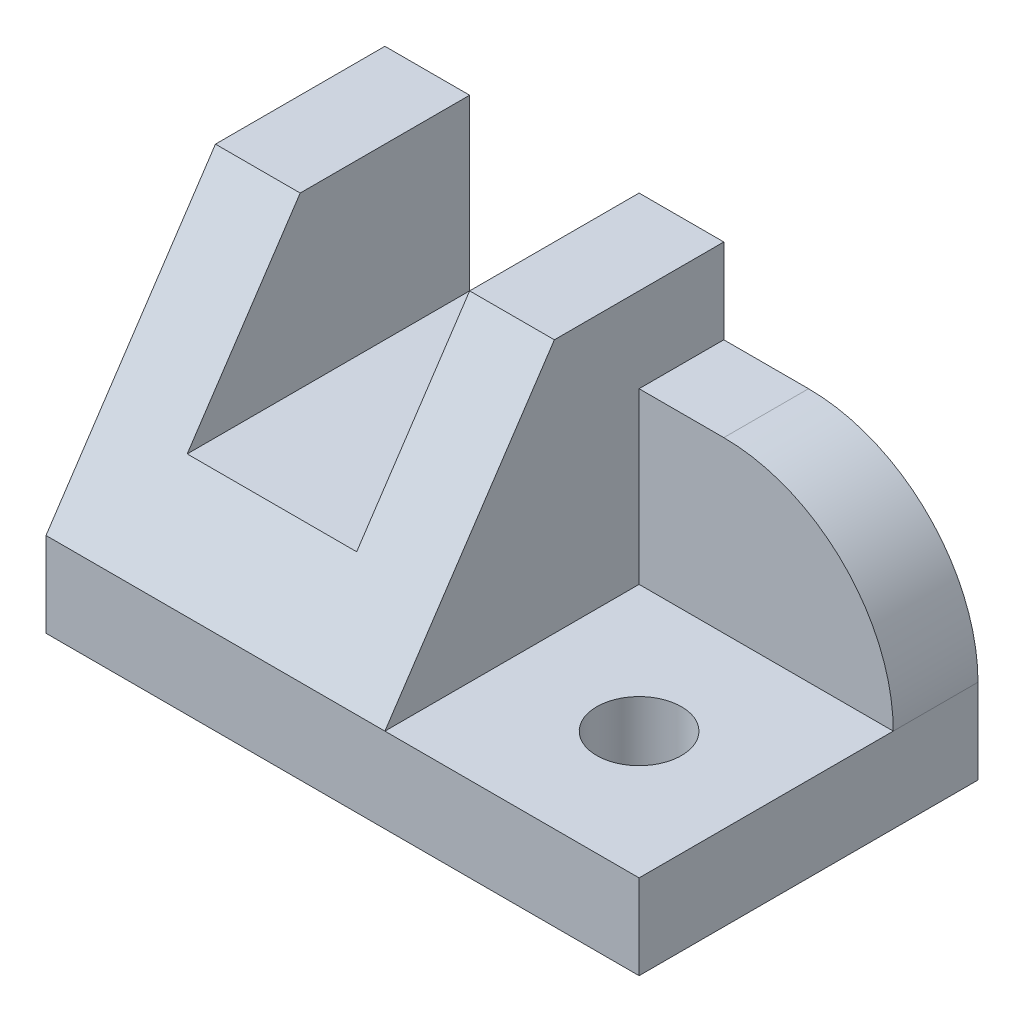
ISO-10303-21;
HEADER;
FILE_DESCRIPTION(('STEP AP214'),'2;1');
FILE_NAME('part.step','',(''),(''),'','','');
FILE_SCHEMA(('AUTOMOTIVE_DESIGN { 1 0 10303 214 1 1 1 1 }'));
ENDSEC;
DATA;
#1=APPLICATION_CONTEXT('core data for automotive mechanical design processes');
#2=APPLICATION_PROTOCOL_DEFINITION('international standard','automotive_design',2000,#1);
#3=PRODUCT_CONTEXT('',#1,'mechanical');
#4=PRODUCT('Part','Part','',(#3));
#5=PRODUCT_RELATED_PRODUCT_CATEGORY('part','',(#4));
#6=PRODUCT_DEFINITION_FORMATION('','',#4);
#7=PRODUCT_DEFINITION_CONTEXT('part definition',#1,'design');
#8=PRODUCT_DEFINITION('design','',#6,#7);
#9=PRODUCT_DEFINITION_SHAPE('','',#8);
#10=(LENGTH_UNIT() NAMED_UNIT(*) SI_UNIT(.MILLI.,.METRE.));
#11=(NAMED_UNIT(*) PLANE_ANGLE_UNIT() SI_UNIT($,.RADIAN.));
#12=(NAMED_UNIT(*) SI_UNIT($,.STERADIAN.) SOLID_ANGLE_UNIT());
#13=UNCERTAINTY_MEASURE_WITH_UNIT(LENGTH_MEASURE(1.E-05),#10,'distance_accuracy_value','');
#14=(GEOMETRIC_REPRESENTATION_CONTEXT(3) GLOBAL_UNCERTAINTY_ASSIGNED_CONTEXT((#13)) GLOBAL_UNIT_ASSIGNED_CONTEXT((#10,
#11,#12)) REPRESENTATION_CONTEXT('',''));
#15=CARTESIAN_POINT('',(0.,0.,0.));
#16=DIRECTION('',(0.,0.,1.));
#17=DIRECTION('',(1.,0.,0.));
#18=AXIS2_PLACEMENT_3D('',#15,#16,#17);
#19=CARTESIAN_POINT('',(50.,-30.,10.));
#20=DIRECTION('',(0.,0.,-1.));
#21=DIRECTION('',(-1.,0.,0.));
#22=AXIS2_PLACEMENT_3D('',#19,#20,#21);
#23=CYLINDRICAL_SURFACE('',#22,20.);
#24=CARTESIAN_POINT('',(50.,-30.,0.));
#25=DIRECTION('',(0.,0.,1.));
#26=DIRECTION('',(1.,0.,0.));
#27=AXIS2_PLACEMENT_3D('',#24,#25,#26);
#28=CIRCLE('',#27,20.);
#29=CARTESIAN_POINT('',(50.,-10.,0.));
#30=VERTEX_POINT('',#29);
#31=CARTESIAN_POINT('',(70.,-30.,0.));
#32=VERTEX_POINT('',#31);
#33=EDGE_CURVE('E158',#30,#32,#28,.F.);
#34=ORIENTED_EDGE('',*,*,#33,.F.);
#35=DIRECTION('',(0.,0.,-1.));
#36=VECTOR('',#35,1.);
#37=CARTESIAN_POINT('',(50.,-10.,10.));
#38=LINE('',#37,#36);
#39=CARTESIAN_POINT('',(50.,-10.,10.));
#40=VERTEX_POINT('',#39);
#41=EDGE_CURVE('E182',#40,#30,#38,.T.);
#42=ORIENTED_EDGE('',*,*,#41,.F.);
#43=CARTESIAN_POINT('',(50.,-30.,10.));
#44=DIRECTION('',(0.,0.,1.));
#45=DIRECTION('',(1.,0.,0.));
#46=AXIS2_PLACEMENT_3D('',#43,#44,#45);
#47=CIRCLE('',#46,20.);
#48=CARTESIAN_POINT('',(70.,-30.,10.));
#49=VERTEX_POINT('',#48);
#50=EDGE_CURVE('E167',#40,#49,#47,.F.);
#51=ORIENTED_EDGE('',*,*,#50,.T.);
#52=DIRECTION('',(0.,0.,-1.));
#53=VECTOR('',#52,1.);
#54=CARTESIAN_POINT('',(70.,-30.,10.));
#55=LINE('',#54,#53);
#56=EDGE_CURVE('E157',#49,#32,#55,.T.);
#57=ORIENTED_EDGE('',*,*,#56,.T.);
#58=EDGE_LOOP('',(#34,#42,#51,#57));
#59=FACE_BOUND('',#58,.T.);
#60=ADVANCED_FACE('F37',(#59),#23,.T.);
#61=CARTESIAN_POINT('',(0.,-10.,10.));
#62=DIRECTION('',(0.,1.,0.));
#63=DIRECTION('',(-1.,0.,0.));
#64=AXIS2_PLACEMENT_3D('',#61,#62,#63);
#65=PLANE('',#64);
#66=DIRECTION('',(1.,0.,0.));
#67=VECTOR('',#66,1.);
#68=CARTESIAN_POINT('',(0.,-10.,0.));
#69=LINE('',#68,#67);
#70=CARTESIAN_POINT('',(40.,-10.,0.));
#71=VERTEX_POINT('',#70);
#72=EDGE_CURVE('E161',#71,#30,#69,.T.);
#73=ORIENTED_EDGE('',*,*,#72,.F.);
#74=DIRECTION('',(0.,0.,-1.));
#75=VECTOR('',#74,1.);
#76=CARTESIAN_POINT('',(40.,-10.,10.));
#77=LINE('',#76,#75);
#78=CARTESIAN_POINT('',(40.,-10.,10.));
#79=VERTEX_POINT('',#78);
#80=EDGE_CURVE('E179',#79,#71,#77,.T.);
#81=ORIENTED_EDGE('',*,*,#80,.F.);
#82=DIRECTION('',(1.,0.,0.));
#83=VECTOR('',#82,1.);
#84=CARTESIAN_POINT('',(0.,-10.,10.));
#85=LINE('',#84,#83);
#86=EDGE_CURVE('E169',#79,#40,#85,.T.);
#87=ORIENTED_EDGE('',*,*,#86,.T.);
#88=ORIENTED_EDGE('',*,*,#41,.T.);
#89=EDGE_LOOP('',(#73,#81,#87,#88));
#90=FACE_BOUND('',#89,.T.);
#91=ADVANCED_FACE('F280',(#90),#65,.T.);
#92=CARTESIAN_POINT('',(0.,0.,10.));
#93=DIRECTION('',(0.,0.,1.));
#94=DIRECTION('',(1.,0.,0.));
#95=AXIS2_PLACEMENT_3D('',#92,#93,#94);
#96=PLANE('',#95);
#97=ORIENTED_EDGE('',*,*,#50,.F.);
#98=ORIENTED_EDGE('',*,*,#86,.F.);
#99=DIRECTION('',(0.,-1.,0.));
#100=VECTOR('',#99,1.);
#101=CARTESIAN_POINT('',(40.,0.,10.));
#102=LINE('',#101,#100);
#103=CARTESIAN_POINT('',(40.,-30.,10.));
#104=VERTEX_POINT('',#103);
#105=EDGE_CURVE('E172',#79,#104,#102,.T.);
#106=ORIENTED_EDGE('',*,*,#105,.T.);
#107=DIRECTION('',(-1.,0.,0.));
#108=VECTOR('',#107,1.);
#109=CARTESIAN_POINT('',(0.,-30.,10.));
#110=LINE('',#109,#108);
#111=EDGE_CURVE('E174',#49,#104,#110,.T.);
#112=ORIENTED_EDGE('',*,*,#111,.F.);
#113=EDGE_LOOP('',(#97,#98,#106,#112));
#114=FACE_BOUND('',#113,.T.);
#115=ADVANCED_FACE('F278',(#114),#96,.T.);
#116=CARTESIAN_POINT('',(0.,0.,0.));
#117=DIRECTION('',(0.,0.,1.));
#118=DIRECTION('',(1.,0.,0.));
#119=AXIS2_PLACEMENT_3D('',#116,#117,#118);
#120=PLANE('',#119);
#121=ORIENTED_EDGE('',*,*,#33,.T.);
#122=DIRECTION('',(0.,1.,0.));
#123=VECTOR('',#122,1.);
#124=CARTESIAN_POINT('',(70.,0.,0.));
#125=LINE('',#124,#123);
#126=CARTESIAN_POINT('',(70.,-40.,0.));
#127=VERTEX_POINT('',#126);
#128=EDGE_CURVE('E215',#127,#32,#125,.T.);
#129=ORIENTED_EDGE('',*,*,#128,.F.);
#130=DIRECTION('',(1.,0.,0.));
#131=VECTOR('',#130,1.);
#132=CARTESIAN_POINT('',(0.,-40.,0.));
#133=LINE('',#132,#131);
#134=CARTESIAN_POINT('',(0.,-40.,0.));
#135=VERTEX_POINT('',#134);
#136=EDGE_CURVE('E152',#135,#127,#133,.T.);
#137=ORIENTED_EDGE('',*,*,#136,.F.);
#138=DIRECTION('',(0.,-1.,0.));
#139=VECTOR('',#138,1.);
#140=CARTESIAN_POINT('',(0.,0.,0.));
#141=LINE('',#140,#139);
#142=CARTESIAN_POINT('',(0.,0.,0.));
#143=VERTEX_POINT('',#142);
#144=EDGE_CURVE('E236',#143,#135,#141,.T.);
#145=ORIENTED_EDGE('',*,*,#144,.F.);
#146=DIRECTION('',(1.,0.,0.));
#147=VECTOR('',#146,1.);
#148=CARTESIAN_POINT('',(0.,0.,0.));
#149=LINE('',#148,#147);
#150=CARTESIAN_POINT('',(10.,0.,0.));
#151=VERTEX_POINT('',#150);
#152=EDGE_CURVE('E233',#143,#151,#149,.T.);
#153=ORIENTED_EDGE('',*,*,#152,.T.);
#154=DIRECTION('',(0.,-1.,0.));
#155=VECTOR('',#154,1.);
#156=CARTESIAN_POINT('',(10.,0.,0.));
#157=LINE('',#156,#155);
#158=CARTESIAN_POINT('',(10.,-20.,0.));
#159=VERTEX_POINT('',#158);
#160=EDGE_CURVE('E230',#151,#159,#157,.T.);
#161=ORIENTED_EDGE('',*,*,#160,.T.);
#162=DIRECTION('',(1.,0.,0.));
#163=VECTOR('',#162,1.);
#164=CARTESIAN_POINT('',(0.,-20.,0.));
#165=LINE('',#164,#163);
#166=CARTESIAN_POINT('',(30.,-20.,0.));
#167=VERTEX_POINT('',#166);
#168=EDGE_CURVE('E227',#159,#167,#165,.T.);
#169=ORIENTED_EDGE('',*,*,#168,.T.);
#170=DIRECTION('',(0.,1.,0.));
#171=VECTOR('',#170,1.);
#172=CARTESIAN_POINT('',(30.,0.,0.));
#173=LINE('',#172,#171);
#174=CARTESIAN_POINT('',(30.,0.,0.));
#175=VERTEX_POINT('',#174);
#176=EDGE_CURVE('E224',#167,#175,#173,.T.);
#177=ORIENTED_EDGE('',*,*,#176,.T.);
#178=DIRECTION('',(1.,0.,0.));
#179=VECTOR('',#178,1.);
#180=CARTESIAN_POINT('',(0.,0.,0.));
#181=LINE('',#180,#179);
#182=CARTESIAN_POINT('',(40.,0.,0.));
#183=VERTEX_POINT('',#182);
#184=EDGE_CURVE('E221',#175,#183,#181,.T.);
#185=ORIENTED_EDGE('',*,*,#184,.T.);
#186=DIRECTION('',(0.,-1.,0.));
#187=VECTOR('',#186,1.);
#188=CARTESIAN_POINT('',(40.,0.,0.));
#189=LINE('',#188,#187);
#190=EDGE_CURVE('E217',#183,#71,#189,.T.);
#191=ORIENTED_EDGE('',*,*,#190,.T.);
#192=ORIENTED_EDGE('',*,*,#72,.T.);
#193=EDGE_LOOP('',(#121,#129,#137,#145,#153,#161,#169,#177,#185,#191,#192));
#194=FACE_BOUND('',#193,.T.);
#195=ADVANCED_FACE('F253',(#194),#120,.F.);
#196=CARTESIAN_POINT('',(70.,0.,40.));
#197=DIRECTION('',(-1.,0.,0.));
#198=DIRECTION('',(0.,0.,1.));
#199=AXIS2_PLACEMENT_3D('',#196,#197,#198);
#200=PLANE('',#199);
#201=ORIENTED_EDGE('',*,*,#128,.T.);
#202=ORIENTED_EDGE('',*,*,#56,.F.);
#203=DIRECTION('',(0.,0.,-1.));
#204=VECTOR('',#203,1.);
#205=CARTESIAN_POINT('',(70.,-30.,40.));
#206=LINE('',#205,#204);
#207=CARTESIAN_POINT('',(70.,-30.,40.));
#208=VERTEX_POINT('',#207);
#209=EDGE_CURVE('E137',#208,#49,#206,.T.);
#210=ORIENTED_EDGE('',*,*,#209,.F.);
#211=DIRECTION('',(0.,1.,0.));
#212=VECTOR('',#211,1.);
#213=CARTESIAN_POINT('',(70.,0.,40.));
#214=LINE('',#213,#212);
#215=CARTESIAN_POINT('',(70.,-40.,40.));
#216=VERTEX_POINT('',#215);
#217=EDGE_CURVE('E143',#216,#208,#214,.T.);
#218=ORIENTED_EDGE('',*,*,#217,.F.);
#219=DIRECTION('',(0.,0.,-1.));
#220=VECTOR('',#219,1.);
#221=CARTESIAN_POINT('',(70.,-40.,40.));
#222=LINE('',#221,#220);
#223=EDGE_CURVE('E212',#216,#127,#222,.T.);
#224=ORIENTED_EDGE('',*,*,#223,.T.);
#225=EDGE_LOOP('',(#201,#202,#210,#218,#224));
#226=FACE_BOUND('',#225,.T.);
#227=ADVANCED_FACE('F156',(#226),#200,.F.);
#228=CARTESIAN_POINT('',(0.,-30.,40.));
#229=DIRECTION('',(0.,-1.,0.));
#230=DIRECTION('',(1.,0.,0.));
#231=AXIS2_PLACEMENT_3D('',#228,#229,#230);
#232=PLANE('',#231);
#233=CARTESIAN_POINT('',(55.,-30.,25.));
#234=DIRECTION('',(0.,1.,0.));
#235=DIRECTION('',(-1.,0.,0.));
#236=AXIS2_PLACEMENT_3D('',#233,#234,#235);
#237=CIRCLE('',#236,5.);
#238=CARTESIAN_POINT('',(50.,-30.,25.));
#239=VERTEX_POINT('',#238);
#240=EDGE_CURVE('E326',#239,#239,#237,.T.);
#241=ORIENTED_EDGE('',*,*,#240,.F.);
#242=EDGE_LOOP('',(#241));
#243=FACE_BOUND('',#242,.T.);
#244=ORIENTED_EDGE('',*,*,#111,.T.);
#245=DIRECTION('',(0.,0.,-1.));
#246=VECTOR('',#245,1.);
#247=CARTESIAN_POINT('',(40.,-30.,40.));
#248=LINE('',#247,#246);
#249=CARTESIAN_POINT('',(40.,-30.,40.));
#250=VERTEX_POINT('',#249);
#251=EDGE_CURVE('E139',#250,#104,#248,.T.);
#252=ORIENTED_EDGE('',*,*,#251,.F.);
#253=DIRECTION('',(-1.,0.,0.));
#254=VECTOR('',#253,1.);
#255=CARTESIAN_POINT('',(0.,-30.,40.));
#256=LINE('',#255,#254);
#257=EDGE_CURVE('E132',#208,#250,#256,.T.);
#258=ORIENTED_EDGE('',*,*,#257,.F.);
#259=ORIENTED_EDGE('',*,*,#209,.T.);
#260=EDGE_LOOP('',(#244,#252,#258,#259));
#261=FACE_BOUND('',#260,.T.);
#262=ADVANCED_FACE('F135',(#243,#261),#232,.F.);
#263=CARTESIAN_POINT('',(40.,0.,40.));
#264=DIRECTION('',(1.,0.,0.));
#265=DIRECTION('',(0.,1.,0.));
#266=AXIS2_PLACEMENT_3D('',#263,#264,#265);
#267=PLANE('',#266);
#268=DIRECTION('',(0.,0.,-1.));
#269=VECTOR('',#268,1.);
#270=CARTESIAN_POINT('',(40.,0.,40.));
#271=LINE('',#270,#269);
#272=CARTESIAN_POINT('',(40.,0.,19.9999999999999));
#273=VERTEX_POINT('',#272);
#274=EDGE_CURVE('E163',#273,#183,#271,.T.);
#275=ORIENTED_EDGE('',*,*,#274,.F.);
#276=DIRECTION('',(0.,0.832050294337844,-0.554700196225228));
#277=VECTOR('',#276,1.);
#278=CARTESIAN_POINT('',(40.,-9.23076923076925,26.1538461538461));
#279=LINE('',#278,#277);
#280=EDGE_CURVE('E45',#273,#250,#279,.F.);
#281=ORIENTED_EDGE('',*,*,#280,.T.);
#282=ORIENTED_EDGE('',*,*,#251,.T.);
#283=ORIENTED_EDGE('',*,*,#105,.F.);
#284=ORIENTED_EDGE('',*,*,#80,.T.);
#285=ORIENTED_EDGE('',*,*,#190,.F.);
#286=EDGE_LOOP('',(#275,#281,#282,#283,#284,#285));
#287=FACE_BOUND('',#286,.T.);
#288=ADVANCED_FACE('F198',(#287),#267,.T.);
#289=CARTESIAN_POINT('',(0.,0.,40.));
#290=DIRECTION('',(0.,1.,0.));
#291=DIRECTION('',(-1.,0.,0.));
#292=AXIS2_PLACEMENT_3D('',#289,#290,#291);
#293=PLANE('',#292);
#294=DIRECTION('',(0.,0.,-1.));
#295=VECTOR('',#294,1.);
#296=CARTESIAN_POINT('',(30.,0.,40.));
#297=LINE('',#296,#295);
#298=CARTESIAN_POINT('',(30.,0.,19.9999999999999));
#299=VERTEX_POINT('',#298);
#300=EDGE_CURVE('E249',#299,#175,#297,.T.);
#301=ORIENTED_EDGE('',*,*,#300,.F.);
#302=DIRECTION('',(1.,0.,0.));
#303=VECTOR('',#302,1.);
#304=CARTESIAN_POINT('',(0.,0.,19.9999999999999));
#305=LINE('',#304,#303);
#306=EDGE_CURVE('E52',#299,#273,#305,.T.);
#307=ORIENTED_EDGE('',*,*,#306,.T.);
#308=ORIENTED_EDGE('',*,*,#274,.T.);
#309=ORIENTED_EDGE('',*,*,#184,.F.);
#310=EDGE_LOOP('',(#301,#307,#308,#309));
#311=FACE_BOUND('',#310,.T.);
#312=ADVANCED_FACE('F251',(#311),#293,.T.);
#313=CARTESIAN_POINT('',(30.,0.,40.));
#314=DIRECTION('',(-1.,0.,0.));
#315=DIRECTION('',(0.,0.,1.));
#316=AXIS2_PLACEMENT_3D('',#313,#314,#315);
#317=PLANE('',#316);
#318=DIRECTION('',(0.,0.,-1.));
#319=VECTOR('',#318,1.);
#320=CARTESIAN_POINT('',(30.,-20.,40.));
#321=LINE('',#320,#319);
#322=CARTESIAN_POINT('',(30.,-20.,33.3333333333332));
#323=VERTEX_POINT('',#322);
#324=EDGE_CURVE('E247',#323,#167,#321,.T.);
#325=ORIENTED_EDGE('',*,*,#324,.F.);
#326=DIRECTION('',(0.,-0.832050294337844,0.554700196225228));
#327=VECTOR('',#326,1.);
#328=CARTESIAN_POINT('',(30.,-9.23076923076926,26.1538461538461));
#329=LINE('',#328,#327);
#330=EDGE_CURVE('E11',#323,#299,#329,.F.);
#331=ORIENTED_EDGE('',*,*,#330,.T.);
#332=ORIENTED_EDGE('',*,*,#300,.T.);
#333=ORIENTED_EDGE('',*,*,#176,.F.);
#334=EDGE_LOOP('',(#325,#331,#332,#333));
#335=FACE_BOUND('',#334,.T.);
#336=ADVANCED_FACE('F256',(#335),#317,.T.);
#337=CARTESIAN_POINT('',(0.,-20.,40.));
#338=DIRECTION('',(0.,1.,0.));
#339=DIRECTION('',(-1.,0.,0.));
#340=AXIS2_PLACEMENT_3D('',#337,#338,#339);
#341=PLANE('',#340);
#342=DIRECTION('',(0.,0.,-1.));
#343=VECTOR('',#342,1.);
#344=CARTESIAN_POINT('',(10.,-20.,40.));
#345=LINE('',#344,#343);
#346=CARTESIAN_POINT('',(10.,-20.,33.3333333333333));
#347=VERTEX_POINT('',#346);
#348=EDGE_CURVE('E245',#347,#159,#345,.T.);
#349=ORIENTED_EDGE('',*,*,#348,.F.);
#350=DIRECTION('',(-1.,0.,0.));
#351=VECTOR('',#350,1.);
#352=CARTESIAN_POINT('',(0.,-20.,33.3333333333332));
#353=LINE('',#352,#351);
#354=EDGE_CURVE('E190',#347,#323,#353,.F.);
#355=ORIENTED_EDGE('',*,*,#354,.T.);
#356=ORIENTED_EDGE('',*,*,#324,.T.);
#357=ORIENTED_EDGE('',*,*,#168,.F.);
#358=EDGE_LOOP('',(#349,#355,#356,#357));
#359=FACE_BOUND('',#358,.T.);
#360=ADVANCED_FACE('F263',(#359),#341,.T.);
#361=CARTESIAN_POINT('',(10.,0.,40.));
#362=DIRECTION('',(1.,0.,0.));
#363=DIRECTION('',(0.,1.,0.));
#364=AXIS2_PLACEMENT_3D('',#361,#362,#363);
#365=PLANE('',#364);
#366=DIRECTION('',(0.,0.,-1.));
#367=VECTOR('',#366,1.);
#368=CARTESIAN_POINT('',(10.,0.,40.));
#369=LINE('',#368,#367);
#370=CARTESIAN_POINT('',(10.,0.,20.));
#371=VERTEX_POINT('',#370);
#372=EDGE_CURVE('E243',#371,#151,#369,.T.);
#373=ORIENTED_EDGE('',*,*,#372,.F.);
#374=DIRECTION('',(0.,0.832050294337844,-0.554700196225228));
#375=VECTOR('',#374,1.);
#376=CARTESIAN_POINT('',(10.,-9.23076923076924,26.1538461538461));
#377=LINE('',#376,#375);
#378=EDGE_CURVE('E187',#371,#347,#377,.F.);
#379=ORIENTED_EDGE('',*,*,#378,.T.);
#380=ORIENTED_EDGE('',*,*,#348,.T.);
#381=ORIENTED_EDGE('',*,*,#160,.F.);
#382=EDGE_LOOP('',(#373,#379,#380,#381));
#383=FACE_BOUND('',#382,.T.);
#384=ADVANCED_FACE('F261',(#383),#365,.T.);
#385=CARTESIAN_POINT('',(0.,0.,40.));
#386=DIRECTION('',(0.,1.,0.));
#387=DIRECTION('',(0.,0.,1.));
#388=AXIS2_PLACEMENT_3D('',#385,#386,#387);
#389=PLANE('',#388);
#390=DIRECTION('',(0.,0.,-1.));
#391=VECTOR('',#390,1.);
#392=CARTESIAN_POINT('',(0.,0.,40.));
#393=LINE('',#392,#391);
#394=CARTESIAN_POINT('',(0.,0.,20.));
#395=VERTEX_POINT('',#394);
#396=EDGE_CURVE('E241',#395,#143,#393,.T.);
#397=ORIENTED_EDGE('',*,*,#396,.F.);
#398=DIRECTION('',(1.,0.,0.));
#399=VECTOR('',#398,1.);
#400=CARTESIAN_POINT('',(0.,0.,19.9999999999999));
#401=LINE('',#400,#399);
#402=EDGE_CURVE('E184',#395,#371,#401,.T.);
#403=ORIENTED_EDGE('',*,*,#402,.T.);
#404=ORIENTED_EDGE('',*,*,#372,.T.);
#405=ORIENTED_EDGE('',*,*,#152,.F.);
#406=EDGE_LOOP('',(#397,#403,#404,#405));
#407=FACE_BOUND('',#406,.T.);
#408=ADVANCED_FACE('F268',(#407),#389,.T.);
#409=CARTESIAN_POINT('',(0.,0.,40.));
#410=DIRECTION('',(1.,0.,0.));
#411=DIRECTION('',(0.,1.,0.));
#412=AXIS2_PLACEMENT_3D('',#409,#410,#411);
#413=PLANE('',#412);
#414=DIRECTION('',(0.,-1.,0.));
#415=VECTOR('',#414,1.);
#416=CARTESIAN_POINT('',(0.,0.,40.));
#417=LINE('',#416,#415);
#418=CARTESIAN_POINT('',(0.,-30.0000000000002,40.));
#419=VERTEX_POINT('',#418);
#420=CARTESIAN_POINT('',(0.,-40.,40.));
#421=VERTEX_POINT('',#420);
#422=EDGE_CURVE('E142',#419,#421,#417,.T.);
#423=ORIENTED_EDGE('',*,*,#422,.F.);
#424=DIRECTION('',(0.,-0.832050294337844,0.554700196225228));
#425=VECTOR('',#424,1.);
#426=CARTESIAN_POINT('',(0.,0.,19.9999999999999));
#427=LINE('',#426,#425);
#428=EDGE_CURVE('E194',#419,#395,#427,.F.);
#429=ORIENTED_EDGE('',*,*,#428,.T.);
#430=ORIENTED_EDGE('',*,*,#396,.T.);
#431=ORIENTED_EDGE('',*,*,#144,.T.);
#432=DIRECTION('',(0.,0.,-1.));
#433=VECTOR('',#432,1.);
#434=CARTESIAN_POINT('',(0.,-40.,40.));
#435=LINE('',#434,#433);
#436=EDGE_CURVE('E210',#421,#135,#435,.T.);
#437=ORIENTED_EDGE('',*,*,#436,.F.);
#438=EDGE_LOOP('',(#423,#429,#430,#431,#437));
#439=FACE_BOUND('',#438,.T.);
#440=ADVANCED_FACE('F207',(#439),#413,.F.);
#441=CARTESIAN_POINT('',(0.,-40.,40.));
#442=DIRECTION('',(0.,1.,0.));
#443=DIRECTION('',(0.,0.,1.));
#444=AXIS2_PLACEMENT_3D('',#441,#442,#443);
#445=PLANE('',#444);
#446=CARTESIAN_POINT('',(55.,-40.,25.));
#447=DIRECTION('',(0.,1.,0.));
#448=DIRECTION('',(-1.,0.,0.));
#449=AXIS2_PLACEMENT_3D('',#446,#447,#448);
#450=CIRCLE('',#449,5.);
#451=CARTESIAN_POINT('',(50.,-40.,25.));
#452=VERTEX_POINT('',#451);
#453=EDGE_CURVE('E218',#452,#452,#450,.T.);
#454=ORIENTED_EDGE('',*,*,#453,.T.);
#455=EDGE_LOOP('',(#454));
#456=FACE_BOUND('',#455,.T.);
#457=ORIENTED_EDGE('',*,*,#136,.T.);
#458=ORIENTED_EDGE('',*,*,#223,.F.);
#459=DIRECTION('',(1.,0.,0.));
#460=VECTOR('',#459,1.);
#461=CARTESIAN_POINT('',(0.,-40.,40.));
#462=LINE('',#461,#460);
#463=EDGE_CURVE('E148',#421,#216,#462,.T.);
#464=ORIENTED_EDGE('',*,*,#463,.F.);
#465=ORIENTED_EDGE('',*,*,#436,.T.);
#466=EDGE_LOOP('',(#457,#458,#464,#465));
#467=FACE_BOUND('',#466,.T.);
#468=ADVANCED_FACE('F270',(#456,#467),#445,.F.);
#469=CARTESIAN_POINT('',(0.,0.,40.));
#470=DIRECTION('',(0.,0.,1.));
#471=DIRECTION('',(1.,0.,0.));
#472=AXIS2_PLACEMENT_3D('',#469,#470,#471);
#473=PLANE('',#472);
#474=DIRECTION('',(-1.,0.,0.));
#475=VECTOR('',#474,1.);
#476=CARTESIAN_POINT('',(0.,-30.0000000000002,40.));
#477=LINE('',#476,#475);
#478=EDGE_CURVE('E192',#250,#419,#477,.T.);
#479=ORIENTED_EDGE('',*,*,#478,.T.);
#480=ORIENTED_EDGE('',*,*,#422,.T.);
#481=ORIENTED_EDGE('',*,*,#463,.T.);
#482=ORIENTED_EDGE('',*,*,#217,.T.);
#483=ORIENTED_EDGE('',*,*,#257,.T.);
#484=EDGE_LOOP('',(#479,#480,#481,#482,#483));
#485=FACE_BOUND('',#484,.T.);
#486=ADVANCED_FACE('F146',(#485),#473,.T.);
#487=CARTESIAN_POINT('',(0.,0.,19.9999999999999));
#488=DIRECTION('',(0.,-0.554700196225228,-0.832050294337844));
#489=DIRECTION('',(1.,0.,0.));
#490=AXIS2_PLACEMENT_3D('',#487,#488,#489);
#491=PLANE('',#490);
#492=ORIENTED_EDGE('',*,*,#330,.F.);
#493=ORIENTED_EDGE('',*,*,#354,.F.);
#494=ORIENTED_EDGE('',*,*,#378,.F.);
#495=ORIENTED_EDGE('',*,*,#402,.F.);
#496=ORIENTED_EDGE('',*,*,#428,.F.);
#497=ORIENTED_EDGE('',*,*,#478,.F.);
#498=ORIENTED_EDGE('',*,*,#280,.F.);
#499=ORIENTED_EDGE('',*,*,#306,.F.);
#500=EDGE_LOOP('',(#492,#493,#494,#495,#496,#497,#498,#499));
#501=FACE_BOUND('',#500,.T.);
#502=ADVANCED_FACE('F39',(#501),#491,.F.);
#503=CARTESIAN_POINT('',(55.,-40.,25.));
#504=DIRECTION('',(0.,1.,0.));
#505=DIRECTION('',(-1.,0.,0.));
#506=AXIS2_PLACEMENT_3D('',#503,#504,#505);
#507=CYLINDRICAL_SURFACE('',#506,5.);
#508=CARTESIAN_POINT('',(50.,-40.,25.));
#509=CARTESIAN_POINT('',(50.,-39.8958333333333,25.));
#510=CARTESIAN_POINT('',(50.,-39.7916666666667,25.));
#511=CARTESIAN_POINT('',(50.,-39.5833333333333,25.));
#512=CARTESIAN_POINT('',(50.,-39.4791666666667,25.));
#513=CARTESIAN_POINT('',(50.,-39.2708333333333,25.));
#514=CARTESIAN_POINT('',(50.,-39.1666666666667,25.));
#515=CARTESIAN_POINT('',(50.,-38.9583333333333,25.));
#516=CARTESIAN_POINT('',(50.,-38.8541666666667,25.));
#517=CARTESIAN_POINT('',(50.,-38.6458333333333,25.));
#518=CARTESIAN_POINT('',(50.,-38.5416666666667,25.));
#519=CARTESIAN_POINT('',(50.,-38.3333333333333,25.));
#520=CARTESIAN_POINT('',(50.,-38.2291666666667,25.));
#521=CARTESIAN_POINT('',(50.,-38.0208333333333,25.));
#522=CARTESIAN_POINT('',(50.,-37.9166666666667,25.));
#523=CARTESIAN_POINT('',(50.,-37.7083333333333,25.));
#524=CARTESIAN_POINT('',(50.,-37.6041666666667,25.));
#525=CARTESIAN_POINT('',(50.,-37.3958333333333,25.));
#526=CARTESIAN_POINT('',(50.,-37.2916666666667,25.));
#527=CARTESIAN_POINT('',(50.,-37.0833333333333,25.));
#528=CARTESIAN_POINT('',(50.,-36.9791666666667,25.));
#529=CARTESIAN_POINT('',(50.,-36.7708333333333,25.));
#530=CARTESIAN_POINT('',(50.,-36.6666666666667,25.));
#531=CARTESIAN_POINT('',(50.,-36.4583333333333,25.));
#532=CARTESIAN_POINT('',(50.,-36.3541666666667,25.));
#533=CARTESIAN_POINT('',(50.,-36.1458333333333,25.));
#534=CARTESIAN_POINT('',(50.,-36.0416666666667,25.));
#535=CARTESIAN_POINT('',(50.,-35.8333333333333,25.));
#536=CARTESIAN_POINT('',(50.,-35.7291666666667,25.));
#537=CARTESIAN_POINT('',(50.,-35.5208333333333,25.));
#538=CARTESIAN_POINT('',(50.,-35.4166666666667,25.));
#539=CARTESIAN_POINT('',(50.,-35.2083333333333,25.));
#540=CARTESIAN_POINT('',(50.,-35.1041666666667,25.));
#541=CARTESIAN_POINT('',(50.,-34.8958333333333,25.));
#542=CARTESIAN_POINT('',(50.,-34.7916666666667,25.));
#543=CARTESIAN_POINT('',(50.,-34.5833333333333,25.));
#544=CARTESIAN_POINT('',(50.,-34.4791666666667,25.));
#545=CARTESIAN_POINT('',(50.,-34.2708333333333,25.));
#546=CARTESIAN_POINT('',(50.,-34.1666666666667,25.));
#547=CARTESIAN_POINT('',(50.,-33.9583333333333,25.));
#548=CARTESIAN_POINT('',(50.,-33.8541666666667,25.));
#549=CARTESIAN_POINT('',(50.,-33.6458333333333,25.));
#550=CARTESIAN_POINT('',(50.,-33.5416666666667,25.));
#551=CARTESIAN_POINT('',(50.,-33.3333333333333,25.));
#552=CARTESIAN_POINT('',(50.,-33.2291666666667,25.));
#553=CARTESIAN_POINT('',(50.,-33.0208333333333,25.));
#554=CARTESIAN_POINT('',(50.,-32.9166666666667,25.));
#555=CARTESIAN_POINT('',(50.,-32.7083333333333,25.));
#556=CARTESIAN_POINT('',(50.,-32.6041666666667,25.));
#557=CARTESIAN_POINT('',(50.,-32.3958333333333,25.));
#558=CARTESIAN_POINT('',(50.,-32.2916666666667,25.));
#559=CARTESIAN_POINT('',(50.,-32.0833333333333,25.));
#560=CARTESIAN_POINT('',(50.,-31.9791666666667,25.));
#561=CARTESIAN_POINT('',(50.,-31.7708333333333,25.));
#562=CARTESIAN_POINT('',(50.,-31.6666666666667,25.));
#563=CARTESIAN_POINT('',(50.,-31.4583333333333,25.));
#564=CARTESIAN_POINT('',(50.,-31.3541666666667,25.));
#565=CARTESIAN_POINT('',(50.,-31.1458333333333,25.));
#566=CARTESIAN_POINT('',(50.,-31.0416666666667,25.));
#567=CARTESIAN_POINT('',(50.,-30.8333333333333,25.));
#568=CARTESIAN_POINT('',(50.,-30.7291666666667,25.));
#569=CARTESIAN_POINT('',(50.,-30.5208333333333,25.));
#570=CARTESIAN_POINT('',(50.,-30.4166666666667,25.));
#571=CARTESIAN_POINT('',(50.,-30.2083333333333,25.));
#572=CARTESIAN_POINT('',(50.,-30.1041666666667,25.));
#573=CARTESIAN_POINT('',(50.,-30.,25.));
#574=B_SPLINE_CURVE_WITH_KNOTS('',3,(#508,#509,#510,#511,#512,#513,#514,#515,#516,#517,#518,
#519,#520,#521,#522,#523,#524,#525,#526,#527,#528,#529,#530,#531,#532,#533,#534,#535,#536,#537,
#538,#539,#540,#541,#542,#543,#544,#545,#546,#547,#548,#549,#550,#551,#552,#553,#554,#555,#556,
#557,#558,#559,#560,#561,#562,#563,#564,#565,#566,#567,#568,#569,#570,#571,#572,#573),
.UNSPECIFIED.,.F.,.F.,(4,2,2,2,2,2,2,2,2,2,2,2,2,2,2,2,2,2,2,2,2,2,2,2,2,2,2,2,2,2,2,2,4),(0.,
0.3125,0.625000000000001,0.937500000000001,1.25,1.5625,1.875,2.1875,2.5,2.8125,3.125,3.4375,
3.75,4.0625,4.375,4.6875,5.,5.3125,5.62500000000001,5.93750000000001,6.25000000000001,
6.56250000000001,6.87500000000001,7.18750000000001,7.50000000000001,7.81250000000001,
8.12500000000001,8.43750000000001,8.75000000000001,9.06250000000001,9.37500000000001,
9.68750000000001,10.),.UNSPECIFIED.);
#575=EDGE_CURVE('BSEAM315',#452,#239,#574,.T.);
#576=ORIENTED_EDGE('',*,*,#453,.F.);
#577=ORIENTED_EDGE('',*,*,#240,.T.);
#578=ORIENTED_EDGE('',*,*,#575,.T.);
#579=ORIENTED_EDGE('',*,*,#575,.F.);
#580=EDGE_LOOP('',(#576,#578,#577,#579));
#581=FACE_BOUND('',#580,.T.);
#582=ADVANCED_FACE('F315',(#581),#507,.F.);
#583=CLOSED_SHELL('',(#60,#91,#115,#195,#227,#262,#288,#312,#336,#360,#384,#408,#440,#468,#486,
#502,#582));
#584=MANIFOLD_SOLID_BREP('B2',#583);
#585=ADVANCED_BREP_SHAPE_REPRESENTATION('',(#18,#584),#14);
#586=SHAPE_DEFINITION_REPRESENTATION(#9,#585);
ENDSEC;
END-ISO-10303-21;
